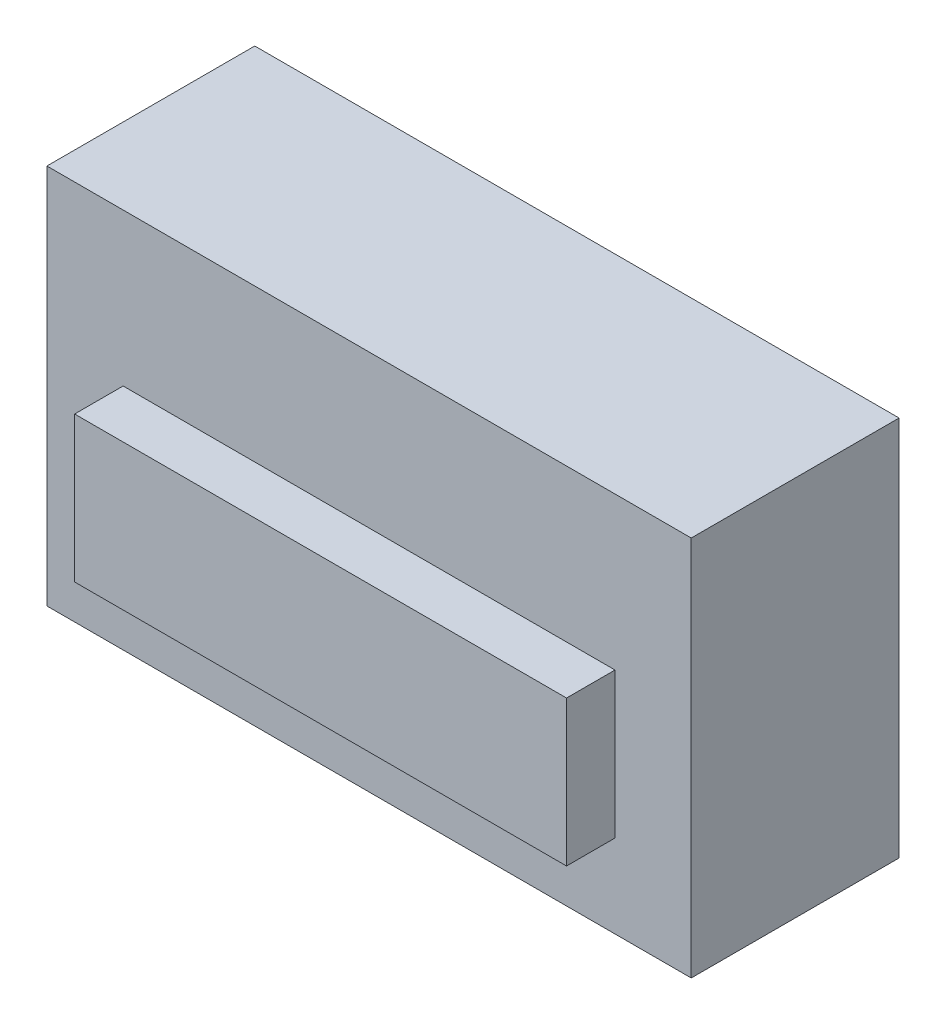
ISO-10303-21;
HEADER;
FILE_DESCRIPTION(('STEP AP214'),'2;1');
FILE_NAME('part.step','',(''),(''),'','','');
FILE_SCHEMA(('AUTOMOTIVE_DESIGN { 1 0 10303 214 1 1 1 1 }'));
ENDSEC;
DATA;
#1=APPLICATION_CONTEXT('core data for automotive mechanical design processes');
#2=APPLICATION_PROTOCOL_DEFINITION('international standard','automotive_design',2000,#1);
#3=PRODUCT_CONTEXT('',#1,'mechanical');
#4=PRODUCT('Part','Part','',(#3));
#5=PRODUCT_RELATED_PRODUCT_CATEGORY('part','',(#4));
#6=PRODUCT_DEFINITION_FORMATION('','',#4);
#7=PRODUCT_DEFINITION_CONTEXT('part definition',#1,'design');
#8=PRODUCT_DEFINITION('design','',#6,#7);
#9=PRODUCT_DEFINITION_SHAPE('','',#8);
#10=(LENGTH_UNIT() NAMED_UNIT(*) SI_UNIT(.MILLI.,.METRE.));
#11=(NAMED_UNIT(*) PLANE_ANGLE_UNIT() SI_UNIT($,.RADIAN.));
#12=(NAMED_UNIT(*) SI_UNIT($,.STERADIAN.) SOLID_ANGLE_UNIT());
#13=UNCERTAINTY_MEASURE_WITH_UNIT(LENGTH_MEASURE(1.E-05),#10,'distance_accuracy_value','');
#14=(GEOMETRIC_REPRESENTATION_CONTEXT(3) GLOBAL_UNCERTAINTY_ASSIGNED_CONTEXT((#13)) GLOBAL_UNIT_ASSIGNED_CONTEXT((#10,
#11,#12)) REPRESENTATION_CONTEXT('',''));
#15=CARTESIAN_POINT('',(0.,0.,0.));
#16=DIRECTION('',(0.,0.,1.));
#17=DIRECTION('',(1.,0.,0.));
#18=AXIS2_PLACEMENT_3D('',#15,#16,#17);
#19=CARTESIAN_POINT('',(46.5,27.5,30.));
#20=DIRECTION('',(-1.,0.,0.));
#21=DIRECTION('',(0.,-1.,0.));
#22=AXIS2_PLACEMENT_3D('',#19,#20,#21);
#23=PLANE('',#22);
#24=DIRECTION('',(0.,1.,0.));
#25=VECTOR('',#24,1.);
#26=CARTESIAN_POINT('',(46.5,27.5,0.));
#27=LINE('',#26,#25);
#28=CARTESIAN_POINT('',(46.5,-27.5,0.));
#29=VERTEX_POINT('',#28);
#30=CARTESIAN_POINT('',(46.5,27.5,0.));
#31=VERTEX_POINT('',#30);
#32=EDGE_CURVE('E119',#29,#31,#27,.T.);
#33=ORIENTED_EDGE('',*,*,#32,.T.);
#34=DIRECTION('',(0.,0.,-1.));
#35=VECTOR('',#34,1.);
#36=CARTESIAN_POINT('',(46.5,27.5,30.));
#37=LINE('',#36,#35);
#38=CARTESIAN_POINT('',(46.5,27.5,30.));
#39=VERTEX_POINT('',#38);
#40=EDGE_CURVE('E11',#39,#31,#37,.T.);
#41=ORIENTED_EDGE('',*,*,#40,.F.);
#42=DIRECTION('',(0.,1.,0.));
#43=VECTOR('',#42,1.);
#44=CARTESIAN_POINT('',(46.5,27.5,30.));
#45=LINE('',#44,#43);
#46=CARTESIAN_POINT('',(46.5,-27.5,30.));
#47=VERTEX_POINT('',#46);
#48=EDGE_CURVE('E128',#47,#39,#45,.T.);
#49=ORIENTED_EDGE('',*,*,#48,.F.);
#50=DIRECTION('',(0.,0.,-1.));
#51=VECTOR('',#50,1.);
#52=CARTESIAN_POINT('',(46.5,-27.5,30.));
#53=LINE('',#52,#51);
#54=EDGE_CURVE('E137',#47,#29,#53,.T.);
#55=ORIENTED_EDGE('',*,*,#54,.T.);
#56=EDGE_LOOP('',(#33,#41,#49,#55));
#57=FACE_BOUND('',#56,.T.);
#58=ADVANCED_FACE('F35',(#57),#23,.F.);
#59=CARTESIAN_POINT('',(-46.5,27.5,30.));
#60=DIRECTION('',(0.,-1.,0.));
#61=DIRECTION('',(0.,0.,-1.));
#62=AXIS2_PLACEMENT_3D('',#59,#60,#61);
#63=PLANE('',#62);
#64=DIRECTION('',(-1.,0.,0.));
#65=VECTOR('',#64,1.);
#66=CARTESIAN_POINT('',(-46.5,27.5,0.));
#67=LINE('',#66,#65);
#68=CARTESIAN_POINT('',(-46.5,27.5,0.));
#69=VERTEX_POINT('',#68);
#70=EDGE_CURVE('E122',#31,#69,#67,.T.);
#71=ORIENTED_EDGE('',*,*,#70,.T.);
#72=DIRECTION('',(0.,0.,-1.));
#73=VECTOR('',#72,1.);
#74=CARTESIAN_POINT('',(-46.5,27.5,30.));
#75=LINE('',#74,#73);
#76=CARTESIAN_POINT('',(-46.5,27.5,30.));
#77=VERTEX_POINT('',#76);
#78=EDGE_CURVE('E42',#77,#69,#75,.T.);
#79=ORIENTED_EDGE('',*,*,#78,.F.);
#80=DIRECTION('',(-1.,0.,0.));
#81=VECTOR('',#80,1.);
#82=CARTESIAN_POINT('',(-46.5,27.5,30.));
#83=LINE('',#82,#81);
#84=EDGE_CURVE('E131',#39,#77,#83,.T.);
#85=ORIENTED_EDGE('',*,*,#84,.F.);
#86=ORIENTED_EDGE('',*,*,#40,.T.);
#87=EDGE_LOOP('',(#71,#79,#85,#86));
#88=FACE_BOUND('',#87,.T.);
#89=ADVANCED_FACE('F168',(#88),#63,.F.);
#90=CARTESIAN_POINT('',(-46.5,27.5,30.));
#91=DIRECTION('',(1.,0.,0.));
#92=DIRECTION('',(0.,1.,0.));
#93=AXIS2_PLACEMENT_3D('',#90,#91,#92);
#94=PLANE('',#93);
#95=DIRECTION('',(0.,-1.,0.));
#96=VECTOR('',#95,1.);
#97=CARTESIAN_POINT('',(-46.5,27.5,0.));
#98=LINE('',#97,#96);
#99=CARTESIAN_POINT('',(-46.5,-27.5,0.));
#100=VERTEX_POINT('',#99);
#101=EDGE_CURVE('E140',#69,#100,#98,.T.);
#102=ORIENTED_EDGE('',*,*,#101,.T.);
#103=DIRECTION('',(0.,0.,-1.));
#104=VECTOR('',#103,1.);
#105=CARTESIAN_POINT('',(-46.5,-27.5,30.));
#106=LINE('',#105,#104);
#107=CARTESIAN_POINT('',(-46.5,-27.5,30.));
#108=VERTEX_POINT('',#107);
#109=EDGE_CURVE('E145',#108,#100,#106,.T.);
#110=ORIENTED_EDGE('',*,*,#109,.F.);
#111=DIRECTION('',(0.,-1.,0.));
#112=VECTOR('',#111,1.);
#113=CARTESIAN_POINT('',(-46.5,27.5,30.));
#114=LINE('',#113,#112);
#115=EDGE_CURVE('E134',#77,#108,#114,.T.);
#116=ORIENTED_EDGE('',*,*,#115,.F.);
#117=ORIENTED_EDGE('',*,*,#78,.T.);
#118=EDGE_LOOP('',(#102,#110,#116,#117));
#119=FACE_BOUND('',#118,.T.);
#120=ADVANCED_FACE('F152',(#119),#94,.F.);
#121=CARTESIAN_POINT('',(-46.5,-27.5,30.));
#122=DIRECTION('',(0.,1.,0.));
#123=DIRECTION('',(0.,0.,1.));
#124=AXIS2_PLACEMENT_3D('',#121,#122,#123);
#125=PLANE('',#124);
#126=DIRECTION('',(1.,0.,0.));
#127=VECTOR('',#126,1.);
#128=CARTESIAN_POINT('',(-46.5,-27.5,0.));
#129=LINE('',#128,#127);
#130=EDGE_CURVE('E132',#100,#29,#129,.T.);
#131=ORIENTED_EDGE('',*,*,#130,.T.);
#132=ORIENTED_EDGE('',*,*,#54,.F.);
#133=DIRECTION('',(1.,0.,0.));
#134=VECTOR('',#133,1.);
#135=CARTESIAN_POINT('',(-46.5,-27.5,30.));
#136=LINE('',#135,#134);
#137=EDGE_CURVE('E136',#108,#47,#136,.T.);
#138=ORIENTED_EDGE('',*,*,#137,.F.);
#139=ORIENTED_EDGE('',*,*,#109,.T.);
#140=EDGE_LOOP('',(#131,#132,#138,#139));
#141=FACE_BOUND('',#140,.T.);
#142=ADVANCED_FACE('F161',(#141),#125,.F.);
#143=CARTESIAN_POINT('',(0.,0.,30.));
#144=DIRECTION('',(0.,0.,1.));
#145=DIRECTION('',(1.,0.,0.));
#146=AXIS2_PLACEMENT_3D('',#143,#144,#145);
#147=PLANE('',#146);
#148=DIRECTION('',(0.,1.,0.));
#149=VECTOR('',#148,1.);
#150=CARTESIAN_POINT('',(35.5,5.49999999999999,30.));
#151=LINE('',#150,#149);
#152=CARTESIAN_POINT('',(35.5,-15.5,30.));
#153=VERTEX_POINT('',#152);
#154=CARTESIAN_POINT('',(35.5,5.49999999999999,30.));
#155=VERTEX_POINT('',#154);
#156=EDGE_CURVE('E49',#153,#155,#151,.T.);
#157=ORIENTED_EDGE('',*,*,#156,.F.);
#158=DIRECTION('',(1.,0.,0.));
#159=VECTOR('',#158,1.);
#160=CARTESIAN_POINT('',(-35.5,-15.5,30.));
#161=LINE('',#160,#159);
#162=CARTESIAN_POINT('',(-35.5,-15.5,30.));
#163=VERTEX_POINT('',#162);
#164=EDGE_CURVE('E53',#163,#153,#161,.T.);
#165=ORIENTED_EDGE('',*,*,#164,.F.);
#166=DIRECTION('',(0.,-1.,0.));
#167=VECTOR('',#166,1.);
#168=CARTESIAN_POINT('',(-35.5,5.49999999999999,30.));
#169=LINE('',#168,#167);
#170=CARTESIAN_POINT('',(-35.5,5.49999999999999,30.));
#171=VERTEX_POINT('',#170);
#172=EDGE_CURVE('E264',#171,#163,#169,.T.);
#173=ORIENTED_EDGE('',*,*,#172,.F.);
#174=DIRECTION('',(-1.,0.,0.));
#175=VECTOR('',#174,1.);
#176=CARTESIAN_POINT('',(-35.5,5.49999999999999,30.));
#177=LINE('',#176,#175);
#178=EDGE_CURVE('E270',#155,#171,#177,.T.);
#179=ORIENTED_EDGE('',*,*,#178,.F.);
#180=EDGE_LOOP('',(#157,#165,#173,#179));
#181=FACE_BOUND('',#180,.T.);
#182=ORIENTED_EDGE('',*,*,#48,.T.);
#183=ORIENTED_EDGE('',*,*,#84,.T.);
#184=ORIENTED_EDGE('',*,*,#115,.T.);
#185=ORIENTED_EDGE('',*,*,#137,.T.);
#186=EDGE_LOOP('',(#182,#183,#184,#185));
#187=FACE_BOUND('',#186,.T.);
#188=ADVANCED_FACE('F167',(#181,#187),#147,.T.);
#189=CARTESIAN_POINT('',(0.,0.,0.));
#190=DIRECTION('',(0.,0.,1.));
#191=DIRECTION('',(1.,0.,0.));
#192=AXIS2_PLACEMENT_3D('',#189,#190,#191);
#193=PLANE('',#192);
#194=ORIENTED_EDGE('',*,*,#32,.F.);
#195=ORIENTED_EDGE('',*,*,#130,.F.);
#196=ORIENTED_EDGE('',*,*,#101,.F.);
#197=ORIENTED_EDGE('',*,*,#70,.F.);
#198=EDGE_LOOP('',(#194,#195,#196,#197));
#199=FACE_BOUND('',#198,.T.);
#200=ADVANCED_FACE('F158',(#199),#193,.F.);
#201=CARTESIAN_POINT('',(35.5,5.49999999999999,37.));
#202=DIRECTION('',(-1.,0.,0.));
#203=DIRECTION('',(0.,0.,1.));
#204=AXIS2_PLACEMENT_3D('',#201,#202,#203);
#205=PLANE('',#204);
#206=ORIENTED_EDGE('',*,*,#156,.T.);
#207=DIRECTION('',(0.,0.,-1.));
#208=VECTOR('',#207,1.);
#209=CARTESIAN_POINT('',(35.5,5.49999999999999,37.));
#210=LINE('',#209,#208);
#211=CARTESIAN_POINT('',(35.5,5.49999999999999,37.));
#212=VERTEX_POINT('',#211);
#213=EDGE_CURVE('E102',#212,#155,#210,.T.);
#214=ORIENTED_EDGE('',*,*,#213,.F.);
#215=DIRECTION('',(0.,1.,0.));
#216=VECTOR('',#215,1.);
#217=CARTESIAN_POINT('',(35.5,5.49999999999999,37.));
#218=LINE('',#217,#216);
#219=CARTESIAN_POINT('',(35.5,-15.5,37.));
#220=VERTEX_POINT('',#219);
#221=EDGE_CURVE('E108',#220,#212,#218,.T.);
#222=ORIENTED_EDGE('',*,*,#221,.F.);
#223=DIRECTION('',(0.,0.,-1.));
#224=VECTOR('',#223,1.);
#225=CARTESIAN_POINT('',(35.5,-15.5,37.));
#226=LINE('',#225,#224);
#227=EDGE_CURVE('E262',#220,#153,#226,.T.);
#228=ORIENTED_EDGE('',*,*,#227,.T.);
#229=EDGE_LOOP('',(#206,#214,#222,#228));
#230=FACE_BOUND('',#229,.T.);
#231=ADVANCED_FACE('F118',(#230),#205,.F.);
#232=CARTESIAN_POINT('',(-35.5,5.49999999999999,37.));
#233=DIRECTION('',(0.,-1.,0.));
#234=DIRECTION('',(0.,0.,-1.));
#235=AXIS2_PLACEMENT_3D('',#232,#233,#234);
#236=PLANE('',#235);
#237=ORIENTED_EDGE('',*,*,#178,.T.);
#238=DIRECTION('',(0.,0.,-1.));
#239=VECTOR('',#238,1.);
#240=CARTESIAN_POINT('',(-35.5,5.49999999999999,37.));
#241=LINE('',#240,#239);
#242=CARTESIAN_POINT('',(-35.5,5.49999999999999,37.));
#243=VERTEX_POINT('',#242);
#244=EDGE_CURVE('E104',#243,#171,#241,.T.);
#245=ORIENTED_EDGE('',*,*,#244,.F.);
#246=DIRECTION('',(-1.,0.,0.));
#247=VECTOR('',#246,1.);
#248=CARTESIAN_POINT('',(-35.5,5.49999999999999,37.));
#249=LINE('',#248,#247);
#250=EDGE_CURVE('E97',#212,#243,#249,.T.);
#251=ORIENTED_EDGE('',*,*,#250,.F.);
#252=ORIENTED_EDGE('',*,*,#213,.T.);
#253=EDGE_LOOP('',(#237,#245,#251,#252));
#254=FACE_BOUND('',#253,.T.);
#255=ADVANCED_FACE('F100',(#254),#236,.F.);
#256=CARTESIAN_POINT('',(-35.5,5.49999999999999,37.));
#257=DIRECTION('',(1.,0.,0.));
#258=DIRECTION('',(0.,0.,-1.));
#259=AXIS2_PLACEMENT_3D('',#256,#257,#258);
#260=PLANE('',#259);
#261=ORIENTED_EDGE('',*,*,#172,.T.);
#262=DIRECTION('',(0.,0.,-1.));
#263=VECTOR('',#262,1.);
#264=CARTESIAN_POINT('',(-35.5,-15.5,37.));
#265=LINE('',#264,#263);
#266=CARTESIAN_POINT('',(-35.5,-15.5,37.));
#267=VERTEX_POINT('',#266);
#268=EDGE_CURVE('E124',#267,#163,#265,.T.);
#269=ORIENTED_EDGE('',*,*,#268,.F.);
#270=DIRECTION('',(0.,-1.,0.));
#271=VECTOR('',#270,1.);
#272=CARTESIAN_POINT('',(-35.5,5.49999999999999,37.));
#273=LINE('',#272,#271);
#274=EDGE_CURVE('E107',#243,#267,#273,.T.);
#275=ORIENTED_EDGE('',*,*,#274,.F.);
#276=ORIENTED_EDGE('',*,*,#244,.T.);
#277=EDGE_LOOP('',(#261,#269,#275,#276));
#278=FACE_BOUND('',#277,.T.);
#279=ADVANCED_FACE('F186',(#278),#260,.F.);
#280=CARTESIAN_POINT('',(-35.5,-15.5,37.));
#281=DIRECTION('',(0.,1.,0.));
#282=DIRECTION('',(0.,0.,1.));
#283=AXIS2_PLACEMENT_3D('',#280,#281,#282);
#284=PLANE('',#283);
#285=ORIENTED_EDGE('',*,*,#164,.T.);
#286=ORIENTED_EDGE('',*,*,#227,.F.);
#287=DIRECTION('',(1.,0.,0.));
#288=VECTOR('',#287,1.);
#289=CARTESIAN_POINT('',(-35.5,-15.5,37.));
#290=LINE('',#289,#288);
#291=EDGE_CURVE('E113',#267,#220,#290,.T.);
#292=ORIENTED_EDGE('',*,*,#291,.F.);
#293=ORIENTED_EDGE('',*,*,#268,.T.);
#294=EDGE_LOOP('',(#285,#286,#292,#293));
#295=FACE_BOUND('',#294,.T.);
#296=ADVANCED_FACE('F189',(#295),#284,.F.);
#297=CARTESIAN_POINT('',(0.,0.,37.));
#298=DIRECTION('',(0.,0.,1.));
#299=DIRECTION('',(1.,0.,0.));
#300=AXIS2_PLACEMENT_3D('',#297,#298,#299);
#301=PLANE('',#300);
#302=ORIENTED_EDGE('',*,*,#221,.T.);
#303=ORIENTED_EDGE('',*,*,#250,.T.);
#304=ORIENTED_EDGE('',*,*,#274,.T.);
#305=ORIENTED_EDGE('',*,*,#291,.T.);
#306=EDGE_LOOP('',(#302,#303,#304,#305));
#307=FACE_BOUND('',#306,.T.);
#308=ADVANCED_FACE('F111',(#307),#301,.T.);
#309=CLOSED_SHELL('',(#58,#89,#120,#142,#188,#200,#231,#255,#279,#296,#308));
#310=MANIFOLD_SOLID_BREP('B2',#309);
#311=ADVANCED_BREP_SHAPE_REPRESENTATION('',(#18,#310),#14);
#312=SHAPE_DEFINITION_REPRESENTATION(#9,#311);
ENDSEC;
END-ISO-10303-21;
